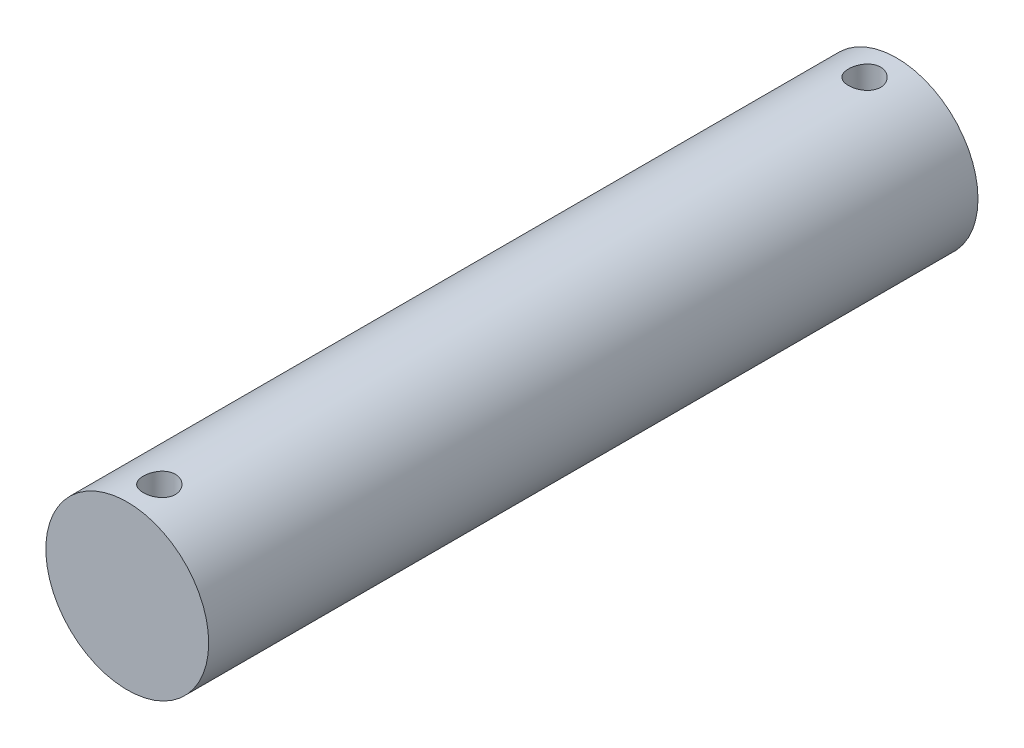
ISO-10303-21;
HEADER;
FILE_DESCRIPTION(('STEP AP214'),'2;1');
FILE_NAME('part.step','',(''),(''),'','','');
FILE_SCHEMA(('AUTOMOTIVE_DESIGN { 1 0 10303 214 1 1 1 1 }'));
ENDSEC;
DATA;
#1=APPLICATION_CONTEXT('core data for automotive mechanical design processes');
#2=APPLICATION_PROTOCOL_DEFINITION('international standard','automotive_design',2000,#1);
#3=PRODUCT_CONTEXT('',#1,'mechanical');
#4=PRODUCT('Part','Part','',(#3));
#5=PRODUCT_RELATED_PRODUCT_CATEGORY('part','',(#4));
#6=PRODUCT_DEFINITION_FORMATION('','',#4);
#7=PRODUCT_DEFINITION_CONTEXT('part definition',#1,'design');
#8=PRODUCT_DEFINITION('design','',#6,#7);
#9=PRODUCT_DEFINITION_SHAPE('','',#8);
#10=(LENGTH_UNIT() NAMED_UNIT(*) SI_UNIT(.MILLI.,.METRE.));
#11=(NAMED_UNIT(*) PLANE_ANGLE_UNIT() SI_UNIT($,.RADIAN.));
#12=(NAMED_UNIT(*) SI_UNIT($,.STERADIAN.) SOLID_ANGLE_UNIT());
#13=UNCERTAINTY_MEASURE_WITH_UNIT(LENGTH_MEASURE(1.E-05),#10,'distance_accuracy_value','');
#14=(GEOMETRIC_REPRESENTATION_CONTEXT(3) GLOBAL_UNCERTAINTY_ASSIGNED_CONTEXT((#13)) GLOBAL_UNIT_ASSIGNED_CONTEXT((#10,
#11,#12)) REPRESENTATION_CONTEXT('',''));
#15=CARTESIAN_POINT('',(0.,0.,0.));
#16=DIRECTION('',(0.,0.,1.));
#17=DIRECTION('',(1.,0.,0.));
#18=AXIS2_PLACEMENT_3D('',#15,#16,#17);
#19=CARTESIAN_POINT('',(0.,0.,30.));
#20=DIRECTION('',(0.,0.,-1.));
#21=DIRECTION('',(-1.,0.,0.));
#22=AXIS2_PLACEMENT_3D('',#19,#20,#21);
#23=CYLINDRICAL_SURFACE('',#22,6.35);
#24=CARTESIAN_POINT('',(0.,-6.35,28.75));
#25=CARTESIAN_POINT('',(0.0694939804326168,-6.34999872344055,28.7499974169715));
#26=CARTESIAN_POINT('',(0.139020856807098,-6.34884746695947,28.7441851223323));
#27=CARTESIAN_POINT('',(0.276110920333324,-6.34436590183971,28.7211070748804));
#28=CARTESIAN_POINT('',(0.343672476376258,-6.34103383426819,28.7038320766701));
#29=CARTESIAN_POINT('',(0.474829848521738,-6.33256289060586,28.6583817049578));
#30=CARTESIAN_POINT('',(0.53842934185297,-6.32742572017194,28.6302166190781));
#31=CARTESIAN_POINT('',(0.659995353609191,-6.31590367713382,28.5638157984467));
#32=CARTESIAN_POINT('',(0.717962238037103,-6.30951888568045,28.5255807186361));
#33=CARTESIAN_POINT('',(0.827384016512086,-6.29611102614492,28.439592456803));
#34=CARTESIAN_POINT('',(0.878754225040864,-6.28908132948856,28.3917325336094));
#35=CARTESIAN_POINT('',(0.97279132993701,-6.2752244237706,28.2880826520332));
#36=CARTESIAN_POINT('',(1.01545756098707,-6.26839723022205,28.2322920879986));
#37=CARTESIAN_POINT('',(1.09123391279336,-6.25565368156531,28.1137582073905));
#38=CARTESIAN_POINT('',(1.12425674252627,-6.24974585984846,28.0509580889053));
#39=CARTESIAN_POINT('',(1.17924978458522,-6.23960391049848,27.9205652920754));
#40=CARTESIAN_POINT('',(1.20122105276671,-6.23536962298579,27.8529730722677));
#41=CARTESIAN_POINT('',(1.23321317099972,-6.22912114018684,27.7158246277484));
#42=CARTESIAN_POINT('',(1.24338237441819,-6.22707940916392,27.6463042888271));
#43=CARTESIAN_POINT('',(1.25194241392171,-6.22536429547634,27.5065165241769));
#44=CARTESIAN_POINT('',(1.25033441599248,-6.22569067835976,27.4362491730926));
#45=CARTESIAN_POINT('',(1.23550573337242,-6.22864988383405,27.2980446635005));
#46=CARTESIAN_POINT('',(1.22245476039046,-6.23124899784788,27.2300884665944));
#47=CARTESIAN_POINT('',(1.18537832222863,-6.23840776786276,27.0973493828874));
#48=CARTESIAN_POINT('',(1.16135234775692,-6.24296751484584,27.0325666435043));
#49=CARTESIAN_POINT('',(1.10284485747249,-6.25356844492135,26.9075224046841));
#50=CARTESIAN_POINT('',(1.06829575022772,-6.25961915520019,26.8472933720178));
#51=CARTESIAN_POINT('',(0.989770436249241,-6.27251408593659,26.7334238611139));
#52=CARTESIAN_POINT('',(0.945793178637779,-6.27935839481092,26.6797841183792));
#53=CARTESIAN_POINT('',(0.848749620379544,-6.29321559250291,26.5796362168699));
#54=CARTESIAN_POINT('',(0.795538391483495,-6.30022934156696,26.5332684988953));
#55=CARTESIAN_POINT('',(0.682019835627286,-6.31352591556468,26.45009527077));
#56=CARTESIAN_POINT('',(0.621712423039484,-6.31980873167657,26.4132898760222));
#57=CARTESIAN_POINT('',(0.495559855492555,-6.33095024356266,26.3502614516207));
#58=CARTESIAN_POINT('',(0.429706667639598,-6.33580682618573,26.3240541029124));
#59=CARTESIAN_POINT('',(0.294415437445408,-6.34353255640573,26.2831134380031));
#60=CARTESIAN_POINT('',(0.224977816567589,-6.3464019370917,26.2683787760871));
#61=CARTESIAN_POINT('',(0.0856960204581712,-6.34979761511535,26.2509997147287));
#62=CARTESIAN_POINT('',(0.0158767138616836,-6.35036116751766,26.2481630611503));
#63=CARTESIAN_POINT('',(-0.123238319169052,-6.34918502460119,26.2541433055637));
#64=CARTESIAN_POINT('',(-0.192534073869591,-6.34744545453345,26.2629595698332));
#65=CARTESIAN_POINT('',(-0.328017411524045,-6.34188181040703,26.2918356330438));
#66=CARTESIAN_POINT('',(-0.394226758532904,-6.3380759676032,26.3117971377749));
#67=CARTESIAN_POINT('',(-0.522358707908791,-6.32880490671267,26.3622899053744));
#68=CARTESIAN_POINT('',(-0.584280996267096,-6.32333956723251,26.3928219415084));
#69=CARTESIAN_POINT('',(-0.702894389008585,-6.31126292459246,26.4640074630924));
#70=CARTESIAN_POINT('',(-0.759514422690819,-6.30463875071603,26.5047771413156));
#71=CARTESIAN_POINT('',(-0.865178401164784,-6.29101022941264,26.5951246432469));
#72=CARTESIAN_POINT('',(-0.914221559867103,-6.2840058426409,26.6447033797357));
#73=CARTESIAN_POINT('',(-1.00407868802173,-6.27028126377194,26.7521356229158));
#74=CARTESIAN_POINT('',(-1.04476087118854,-6.26356677403919,26.8101002099198));
#75=CARTESIAN_POINT('',(-1.11581163487925,-6.25130144140895,26.9321532154163));
#76=CARTESIAN_POINT('',(-1.14618062108292,-6.24575055274337,26.9962413929044));
#77=CARTESIAN_POINT('',(-1.19556121034271,-6.23648663322854,27.1284042020453));
#78=CARTESIAN_POINT('',(-1.21463070325767,-6.23276425161642,27.1964565174941));
#79=CARTESIAN_POINT('',(-1.24104736373123,-6.22755858712954,27.3348802434369));
#80=CARTESIAN_POINT('',(-1.24839600622804,-6.2260750225259,27.4052513609979));
#81=CARTESIAN_POINT('',(-1.25110911670658,-6.22553026233713,27.54499277197));
#82=CARTESIAN_POINT('',(-1.24668173183846,-6.22642699327119,27.6143589442989));
#83=CARTESIAN_POINT('',(-1.22642690288144,-6.23044796366243,27.7513372149343));
#84=CARTESIAN_POINT('',(-1.21059954408838,-6.23357218645326,27.8189493263609));
#85=CARTESIAN_POINT('',(-1.16808561930223,-6.24167758718142,27.9503730471303));
#86=CARTESIAN_POINT('',(-1.1414238104125,-6.24665452942732,28.0141929432507));
#87=CARTESIAN_POINT('',(-1.07802140699671,-6.25790715548942,28.1364863896161));
#88=CARTESIAN_POINT('',(-1.04128000120944,-6.26418294383389,28.1949595090179));
#89=CARTESIAN_POINT('',(-0.958047153780957,-6.27745535581054,28.305937625676));
#90=CARTESIAN_POINT('',(-0.911405090098397,-6.28446214955247,28.3583284614444));
#91=CARTESIAN_POINT('',(-0.810006714298533,-6.29833330286004,28.4546087685327));
#92=CARTESIAN_POINT('',(-0.755248540568529,-6.30519762933471,28.4984962840818));
#93=CARTESIAN_POINT('',(-0.638509398203909,-6.31809192156363,28.5769408554925));
#94=CARTESIAN_POINT('',(-0.576461177409875,-6.32411277788587,28.6113993840931));
#95=CARTESIAN_POINT('',(-0.447354677582577,-6.33455228311075,28.6693463510289));
#96=CARTESIAN_POINT('',(-0.38030102851324,-6.33897239107068,28.6928447849748));
#97=CARTESIAN_POINT('',(-0.260903753738919,-6.3448426925249,28.7235965876865));
#98=CARTESIAN_POINT('',(-0.209244697378744,-6.34676546742744,28.7334804045104));
#99=CARTESIAN_POINT('',(-0.10506334458243,-6.34934458466464,28.7466829882463));
#100=CARTESIAN_POINT('',(-0.0525410741960242,-6.35000096514553,28.7500019529043));
#101=CARTESIAN_POINT('',(0.,-6.35,28.75));
#102=B_SPLINE_CURVE_WITH_KNOTS('',3,(#24,#25,#26,#27,#28,#29,#30,#31,#32,#33,#34,#35,#36,#37,
#38,#39,#40,#41,#42,#43,#44,#45,#46,#47,#48,#49,#50,#51,#52,#53,#54,#55,#56,#57,#58,#59,#60,#61,
#62,#63,#64,#65,#66,#67,#68,#69,#70,#71,#72,#73,#74,#75,#76,#77,#78,#79,#80,#81,#82,#83,#84,#85,
#86,#87,#88,#89,#90,#91,#92,#93,#94,#95,#96,#97,#98,#99,#100,#101),.UNSPECIFIED.,.T.,.F.,(4,2,2,
2,2,2,2,2,2,2,2,2,2,2,2,2,2,2,2,2,2,2,2,2,2,2,2,2,2,2,2,2,2,2,2,2,2,2,4),(0.,0.20828974718966,
0.416747697814534,0.625009202121001,0.83325716468066,1.04395644558372,1.25467182595345,
1.46723931776154,1.67978649721884,1.88963196168972,2.09945665097822,2.3062210720878,
2.51299508901675,2.72112629808271,2.92928071788109,3.14105959839086,3.35284103463857,
3.56493468769528,3.77700345899184,3.98563198908576,4.19424917376995,4.40105490064573,
4.60787575916645,4.81715935266284,5.02646464445816,5.23885147330544,5.45122994673927,
5.66251073275075,5.87376492933512,6.08131002421398,6.28885356623402,6.4959255069745,
6.70301411889162,6.91351361259455,7.12406146403359,7.33673198768616,7.5492081746515,
7.70669083222362,7.86416874604055),.UNSPECIFIED.);
#103=CARTESIAN_POINT('',(0.,-6.35,28.75));
#104=VERTEX_POINT('',#103);
#105=EDGE_CURVE('E35',#104,#104,#102,.T.);
#106=ORIENTED_EDGE('',*,*,#105,.T.);
#107=EDGE_LOOP('',(#106));
#108=FACE_BOUND('',#107,.T.);
#109=CARTESIAN_POINT('',(0.,6.35,28.75));
#110=CARTESIAN_POINT('',(-0.0694939804326168,6.34999872344055,28.7499974169715));
#111=CARTESIAN_POINT('',(-0.139020856807098,6.34884746695947,28.7441851223323));
#112=CARTESIAN_POINT('',(-0.276110920333324,6.34436590183971,28.7211070748804));
#113=CARTESIAN_POINT('',(-0.343672476376258,6.34103383426819,28.7038320766701));
#114=CARTESIAN_POINT('',(-0.474829848521738,6.33256289060586,28.6583817049578));
#115=CARTESIAN_POINT('',(-0.53842934185297,6.32742572017194,28.6302166190781));
#116=CARTESIAN_POINT('',(-0.659995353609191,6.31590367713382,28.5638157984467));
#117=CARTESIAN_POINT('',(-0.717962238037103,6.30951888568045,28.5255807186361));
#118=CARTESIAN_POINT('',(-0.827384016512086,6.29611102614492,28.439592456803));
#119=CARTESIAN_POINT('',(-0.878754225040864,6.28908132948856,28.3917325336094));
#120=CARTESIAN_POINT('',(-0.97279132993701,6.2752244237706,28.2880826520332));
#121=CARTESIAN_POINT('',(-1.01545756098707,6.26839723022205,28.2322920879986));
#122=CARTESIAN_POINT('',(-1.09123391279336,6.25565368156531,28.1137582073905));
#123=CARTESIAN_POINT('',(-1.12425674252627,6.24974585984846,28.0509580889053));
#124=CARTESIAN_POINT('',(-1.17924978458522,6.23960391049848,27.9205652920754));
#125=CARTESIAN_POINT('',(-1.20122105276671,6.23536962298579,27.8529730722677));
#126=CARTESIAN_POINT('',(-1.23321317099972,6.22912114018684,27.7158246277484));
#127=CARTESIAN_POINT('',(-1.24338237441819,6.22707940916392,27.6463042888271));
#128=CARTESIAN_POINT('',(-1.25194241392171,6.22536429547634,27.5065165241769));
#129=CARTESIAN_POINT('',(-1.25033441599248,6.22569067835976,27.4362491730926));
#130=CARTESIAN_POINT('',(-1.23550573337242,6.22864988383405,27.2980446635005));
#131=CARTESIAN_POINT('',(-1.22245476039046,6.23124899784788,27.2300884665944));
#132=CARTESIAN_POINT('',(-1.18537832222863,6.23840776786276,27.0973493828874));
#133=CARTESIAN_POINT('',(-1.16135234775692,6.24296751484584,27.0325666435043));
#134=CARTESIAN_POINT('',(-1.10284485747249,6.25356844492135,26.9075224046841));
#135=CARTESIAN_POINT('',(-1.06829575022772,6.25961915520019,26.8472933720178));
#136=CARTESIAN_POINT('',(-0.989770436249241,6.27251408593659,26.7334238611139));
#137=CARTESIAN_POINT('',(-0.945793178637779,6.27935839481092,26.6797841183792));
#138=CARTESIAN_POINT('',(-0.848749620379544,6.29321559250291,26.5796362168699));
#139=CARTESIAN_POINT('',(-0.795538391483495,6.30022934156696,26.5332684988953));
#140=CARTESIAN_POINT('',(-0.682019835627286,6.31352591556468,26.45009527077));
#141=CARTESIAN_POINT('',(-0.621712423039484,6.31980873167657,26.4132898760222));
#142=CARTESIAN_POINT('',(-0.495559855492555,6.33095024356266,26.3502614516207));
#143=CARTESIAN_POINT('',(-0.429706667639598,6.33580682618573,26.3240541029124));
#144=CARTESIAN_POINT('',(-0.294415437445408,6.34353255640573,26.2831134380031));
#145=CARTESIAN_POINT('',(-0.224977816567589,6.3464019370917,26.2683787760871));
#146=CARTESIAN_POINT('',(-0.0856960204581712,6.34979761511535,26.2509997147287));
#147=CARTESIAN_POINT('',(-0.0158767138616836,6.35036116751766,26.2481630611503));
#148=CARTESIAN_POINT('',(0.123238319169052,6.34918502460119,26.2541433055637));
#149=CARTESIAN_POINT('',(0.192534073869591,6.34744545453345,26.2629595698332));
#150=CARTESIAN_POINT('',(0.328017411524045,6.34188181040703,26.2918356330438));
#151=CARTESIAN_POINT('',(0.394226758532904,6.3380759676032,26.3117971377749));
#152=CARTESIAN_POINT('',(0.522358707908791,6.32880490671267,26.3622899053744));
#153=CARTESIAN_POINT('',(0.584280996267096,6.32333956723251,26.3928219415084));
#154=CARTESIAN_POINT('',(0.702894389008585,6.31126292459246,26.4640074630924));
#155=CARTESIAN_POINT('',(0.759514422690819,6.30463875071603,26.5047771413156));
#156=CARTESIAN_POINT('',(0.865178401164784,6.29101022941264,26.5951246432469));
#157=CARTESIAN_POINT('',(0.914221559867103,6.2840058426409,26.6447033797357));
#158=CARTESIAN_POINT('',(1.00407868802173,6.27028126377194,26.7521356229158));
#159=CARTESIAN_POINT('',(1.04476087118854,6.26356677403919,26.8101002099198));
#160=CARTESIAN_POINT('',(1.11581163487925,6.25130144140895,26.9321532154163));
#161=CARTESIAN_POINT('',(1.14618062108292,6.24575055274337,26.9962413929044));
#162=CARTESIAN_POINT('',(1.19556121034271,6.23648663322854,27.1284042020453));
#163=CARTESIAN_POINT('',(1.21463070325767,6.23276425161642,27.1964565174941));
#164=CARTESIAN_POINT('',(1.24104736373123,6.22755858712954,27.3348802434369));
#165=CARTESIAN_POINT('',(1.24839600622804,6.2260750225259,27.4052513609979));
#166=CARTESIAN_POINT('',(1.25110911670658,6.22553026233713,27.54499277197));
#167=CARTESIAN_POINT('',(1.24668173183846,6.22642699327119,27.6143589442989));
#168=CARTESIAN_POINT('',(1.22642690288144,6.23044796366243,27.7513372149343));
#169=CARTESIAN_POINT('',(1.21059954408838,6.23357218645326,27.8189493263609));
#170=CARTESIAN_POINT('',(1.16808561930223,6.24167758718142,27.9503730471303));
#171=CARTESIAN_POINT('',(1.1414238104125,6.24665452942732,28.0141929432507));
#172=CARTESIAN_POINT('',(1.07802140699671,6.25790715548942,28.1364863896161));
#173=CARTESIAN_POINT('',(1.04128000120944,6.26418294383389,28.1949595090179));
#174=CARTESIAN_POINT('',(0.958047153780957,6.27745535581054,28.305937625676));
#175=CARTESIAN_POINT('',(0.911405090098397,6.28446214955247,28.3583284614444));
#176=CARTESIAN_POINT('',(0.810006714298533,6.29833330286004,28.4546087685327));
#177=CARTESIAN_POINT('',(0.755248540568529,6.30519762933471,28.4984962840818));
#178=CARTESIAN_POINT('',(0.638509398203909,6.31809192156363,28.5769408554925));
#179=CARTESIAN_POINT('',(0.576461177409875,6.32411277788587,28.6113993840931));
#180=CARTESIAN_POINT('',(0.447354677582577,6.33455228311075,28.6693463510289));
#181=CARTESIAN_POINT('',(0.38030102851324,6.33897239107068,28.6928447849748));
#182=CARTESIAN_POINT('',(0.260903753738919,6.3448426925249,28.7235965876865));
#183=CARTESIAN_POINT('',(0.209244697378744,6.34676546742744,28.7334804045104));
#184=CARTESIAN_POINT('',(0.10506334458243,6.34934458466464,28.7466829882463));
#185=CARTESIAN_POINT('',(0.0525410741960242,6.35000096514553,28.7500019529043));
#186=CARTESIAN_POINT('',(0.,6.35,28.75));
#187=B_SPLINE_CURVE_WITH_KNOTS('',3,(#109,#110,#111,#112,#113,#114,#115,#116,#117,#118,#119,
#120,#121,#122,#123,#124,#125,#126,#127,#128,#129,#130,#131,#132,#133,#134,#135,#136,#137,#138,
#139,#140,#141,#142,#143,#144,#145,#146,#147,#148,#149,#150,#151,#152,#153,#154,#155,#156,#157,
#158,#159,#160,#161,#162,#163,#164,#165,#166,#167,#168,#169,#170,#171,#172,#173,#174,#175,#176,
#177,#178,#179,#180,#181,#182,#183,#184,#185,#186),.UNSPECIFIED.,.T.,.F.,(4,2,2,2,2,2,2,2,2,2,2,
2,2,2,2,2,2,2,2,2,2,2,2,2,2,2,2,2,2,2,2,2,2,2,2,2,2,2,4),(0.,0.20828974718966,0.416747697814534,
0.625009202121001,0.83325716468066,1.04395644558372,1.25467182595345,1.46723931776154,
1.67978649721884,1.88963196168972,2.09945665097822,2.3062210720878,2.51299508901675,
2.72112629808271,2.92928071788109,3.14105959839086,3.35284103463857,3.56493468769528,
3.77700345899184,3.98563198908576,4.19424917376995,4.40105490064573,4.60787575916645,
4.81715935266284,5.02646464445816,5.23885147330544,5.45122994673927,5.66251073275075,
5.87376492933512,6.08131002421398,6.28885356623402,6.4959255069745,6.70301411889162,
6.91351361259455,7.12406146403359,7.33673198768616,7.5492081746515,7.70669083222362,
7.86416874604055),.UNSPECIFIED.);
#188=CARTESIAN_POINT('',(0.,6.35,28.75));
#189=VERTEX_POINT('',#188);
#190=EDGE_CURVE('E87',#189,#189,#187,.T.);
#191=ORIENTED_EDGE('',*,*,#190,.T.);
#192=EDGE_LOOP('',(#191));
#193=FACE_BOUND('',#192,.T.);
#194=CARTESIAN_POINT('',(0.,-6.35,-26.25));
#195=CARTESIAN_POINT('',(0.0694939804326171,-6.34999872344055,-26.2500025830285));
#196=CARTESIAN_POINT('',(0.139020856807098,-6.34884746695947,-26.2558148776677));
#197=CARTESIAN_POINT('',(0.276110920333324,-6.34436590183971,-26.2788929251196));
#198=CARTESIAN_POINT('',(0.343672476376258,-6.34103383426819,-26.2961679233299));
#199=CARTESIAN_POINT('',(0.474829848521738,-6.33256289060586,-26.3416182950422));
#200=CARTESIAN_POINT('',(0.53842934185297,-6.32742572017194,-26.3697833809219));
#201=CARTESIAN_POINT('',(0.659995353609191,-6.31590367713382,-26.4361842015533));
#202=CARTESIAN_POINT('',(0.717962238037103,-6.30951888568045,-26.4744192813639));
#203=CARTESIAN_POINT('',(0.827384016512086,-6.29611102614492,-26.560407543197));
#204=CARTESIAN_POINT('',(0.878754225040864,-6.28908132948856,-26.6082674663906));
#205=CARTESIAN_POINT('',(0.97279132993701,-6.2752244237706,-26.7119173479668));
#206=CARTESIAN_POINT('',(1.01545756098707,-6.26839723022205,-26.7677079120014));
#207=CARTESIAN_POINT('',(1.09123391279335,-6.25565368156531,-26.8862417926095));
#208=CARTESIAN_POINT('',(1.12425674252627,-6.24974585984846,-26.9490419110947));
#209=CARTESIAN_POINT('',(1.17924978458522,-6.23960391049848,-27.0794347079246));
#210=CARTESIAN_POINT('',(1.20122105276671,-6.23536962298579,-27.1470269277323));
#211=CARTESIAN_POINT('',(1.23321317099972,-6.22912114018685,-27.2841753722516));
#212=CARTESIAN_POINT('',(1.24338237441819,-6.22707940916393,-27.3536957111729));
#213=CARTESIAN_POINT('',(1.25194241392171,-6.22536429547634,-27.4934834758231));
#214=CARTESIAN_POINT('',(1.25033441599248,-6.22569067835976,-27.5637508269074));
#215=CARTESIAN_POINT('',(1.23550573337242,-6.22864988383405,-27.7019553364995));
#216=CARTESIAN_POINT('',(1.22245476039046,-6.23124899784788,-27.7699115334056));
#217=CARTESIAN_POINT('',(1.18537832222863,-6.23840776786276,-27.9026506171126));
#218=CARTESIAN_POINT('',(1.16135234775692,-6.24296751484584,-27.9674333564957));
#219=CARTESIAN_POINT('',(1.10284485747249,-6.25356844492134,-28.0924775953159));
#220=CARTESIAN_POINT('',(1.06829575022772,-6.25961915520019,-28.1527066279822));
#221=CARTESIAN_POINT('',(0.989770436249241,-6.27251408593659,-28.2665761388861));
#222=CARTESIAN_POINT('',(0.945793178637779,-6.27935839481092,-28.3202158816208));
#223=CARTESIAN_POINT('',(0.848749620379544,-6.29321559250291,-28.4203637831301));
#224=CARTESIAN_POINT('',(0.795538391483495,-6.30022934156696,-28.4667315011047));
#225=CARTESIAN_POINT('',(0.682019835627286,-6.31352591556468,-28.54990472923));
#226=CARTESIAN_POINT('',(0.621712423039484,-6.31980873167657,-28.5867101239778));
#227=CARTESIAN_POINT('',(0.495559855492555,-6.33095024356266,-28.6497385483793));
#228=CARTESIAN_POINT('',(0.429706667639598,-6.33580682618573,-28.6759458970876));
#229=CARTESIAN_POINT('',(0.294415437445408,-6.34353255640573,-28.7168865619969));
#230=CARTESIAN_POINT('',(0.224977816567589,-6.3464019370917,-28.7316212239129));
#231=CARTESIAN_POINT('',(0.0856960204581712,-6.34979761511535,-28.7490002852713));
#232=CARTESIAN_POINT('',(0.0158767138616836,-6.35036116751766,-28.7518369388497));
#233=CARTESIAN_POINT('',(-0.123238319169052,-6.34918502460119,-28.7458566944363));
#234=CARTESIAN_POINT('',(-0.192534073869591,-6.34744545453345,-28.7370404301668));
#235=CARTESIAN_POINT('',(-0.328017411524046,-6.34188181040703,-28.7081643669562));
#236=CARTESIAN_POINT('',(-0.394226758532905,-6.3380759676032,-28.6882028622251));
#237=CARTESIAN_POINT('',(-0.522358707908791,-6.32880490671267,-28.6377100946256));
#238=CARTESIAN_POINT('',(-0.584280996267096,-6.32333956723251,-28.6071780584916));
#239=CARTESIAN_POINT('',(-0.702894389008584,-6.31126292459246,-28.5359925369076));
#240=CARTESIAN_POINT('',(-0.759514422690817,-6.30463875071603,-28.4952228586844));
#241=CARTESIAN_POINT('',(-0.865178401164783,-6.29101022941264,-28.4048753567531));
#242=CARTESIAN_POINT('',(-0.914221559867102,-6.2840058426409,-28.3552966202643));
#243=CARTESIAN_POINT('',(-1.00407868802173,-6.27028126377194,-28.2478643770842));
#244=CARTESIAN_POINT('',(-1.04476087118854,-6.26356677403919,-28.1898997900802));
#245=CARTESIAN_POINT('',(-1.11581163487925,-6.25130144140895,-28.0678467845837));
#246=CARTESIAN_POINT('',(-1.14618062108292,-6.24575055274337,-28.0037586070956));
#247=CARTESIAN_POINT('',(-1.19556121034271,-6.23648663322854,-27.8715957979547));
#248=CARTESIAN_POINT('',(-1.21463070325767,-6.23276425161642,-27.8035434825059));
#249=CARTESIAN_POINT('',(-1.24104736373123,-6.22755858712954,-27.6651197565631));
#250=CARTESIAN_POINT('',(-1.24839600622804,-6.2260750225259,-27.5947486390021));
#251=CARTESIAN_POINT('',(-1.25110911670658,-6.22553026233713,-27.45500722803));
#252=CARTESIAN_POINT('',(-1.24668173183846,-6.22642699327119,-27.3856410557011));
#253=CARTESIAN_POINT('',(-1.22642690288144,-6.23044796366243,-27.2486627850657));
#254=CARTESIAN_POINT('',(-1.21059954408838,-6.23357218645326,-27.1810506736391));
#255=CARTESIAN_POINT('',(-1.16808561930223,-6.24167758718142,-27.0496269528697));
#256=CARTESIAN_POINT('',(-1.14142381041251,-6.24665452942732,-26.9858070567493));
#257=CARTESIAN_POINT('',(-1.07802140699671,-6.25790715548942,-26.8635136103839));
#258=CARTESIAN_POINT('',(-1.04128000120944,-6.26418294383389,-26.8050404909821));
#259=CARTESIAN_POINT('',(-0.958047153780958,-6.27745535581054,-26.694062374324));
#260=CARTESIAN_POINT('',(-0.911405090098398,-6.28446214955247,-26.6416715385556));
#261=CARTESIAN_POINT('',(-0.810006714298535,-6.29833330286004,-26.5453912314673));
#262=CARTESIAN_POINT('',(-0.75524854056853,-6.30519762933471,-26.5015037159183));
#263=CARTESIAN_POINT('',(-0.638509398203909,-6.31809192156363,-26.4230591445075));
#264=CARTESIAN_POINT('',(-0.576461177409875,-6.32411277788587,-26.3886006159069));
#265=CARTESIAN_POINT('',(-0.447354677582576,-6.33455228311075,-26.3306536489711));
#266=CARTESIAN_POINT('',(-0.38030102851324,-6.33897239107068,-26.3071552150252));
#267=CARTESIAN_POINT('',(-0.260903753738919,-6.3448426925249,-26.2764034123135));
#268=CARTESIAN_POINT('',(-0.209244697378744,-6.34676546742744,-26.2665195954896));
#269=CARTESIAN_POINT('',(-0.10506334458243,-6.34934458466464,-26.2533170117537));
#270=CARTESIAN_POINT('',(-0.0525410741960242,-6.35000096514553,-26.2499980470957));
#271=CARTESIAN_POINT('',(0.,-6.35,-26.25));
#272=B_SPLINE_CURVE_WITH_KNOTS('',3,(#194,#195,#196,#197,#198,#199,#200,#201,#202,#203,#204,
#205,#206,#207,#208,#209,#210,#211,#212,#213,#214,#215,#216,#217,#218,#219,#220,#221,#222,#223,
#224,#225,#226,#227,#228,#229,#230,#231,#232,#233,#234,#235,#236,#237,#238,#239,#240,#241,#242,
#243,#244,#245,#246,#247,#248,#249,#250,#251,#252,#253,#254,#255,#256,#257,#258,#259,#260,#261,
#262,#263,#264,#265,#266,#267,#268,#269,#270,#271),.UNSPECIFIED.,.T.,.F.,(4,2,2,2,2,2,2,2,2,2,2,
2,2,2,2,2,2,2,2,2,2,2,2,2,2,2,2,2,2,2,2,2,2,2,2,2,2,2,4),(0.,0.20828974718966,0.416747697814534,
0.625009202121001,0.83325716468066,1.04395644558372,1.25467182595345,1.46723931776153,
1.67978649721884,1.88963196168972,2.09945665097822,2.30622107208779,2.51299508901675,
2.72112629808271,2.92928071788109,3.14105959839087,3.35284103463857,3.56493468769528,
3.77700345899184,3.98563198908576,4.19424917376995,4.40105490064574,4.60787575916645,
4.81715935266284,5.02646464445816,5.23885147330544,5.45122994673928,5.66251073275075,
5.87376492933513,6.08131002421399,6.28885356623402,6.49592550697449,6.70301411889162,
6.91351361259455,7.12406146403359,7.33673198768616,7.5492081746515,7.70669083222363,
7.86416874604056),.UNSPECIFIED.);
#273=CARTESIAN_POINT('',(0.,-6.35,-26.25));
#274=VERTEX_POINT('',#273);
#275=EDGE_CURVE('E57',#274,#274,#272,.T.);
#276=ORIENTED_EDGE('',*,*,#275,.T.);
#277=EDGE_LOOP('',(#276));
#278=FACE_BOUND('',#277,.T.);
#279=CARTESIAN_POINT('',(0.,6.35,-26.25));
#280=CARTESIAN_POINT('',(-0.0694939804326171,6.34999872344055,-26.2500025830285));
#281=CARTESIAN_POINT('',(-0.139020856807098,6.34884746695947,-26.2558148776677));
#282=CARTESIAN_POINT('',(-0.276110920333324,6.34436590183971,-26.2788929251196));
#283=CARTESIAN_POINT('',(-0.343672476376258,6.34103383426819,-26.2961679233299));
#284=CARTESIAN_POINT('',(-0.474829848521738,6.33256289060586,-26.3416182950422));
#285=CARTESIAN_POINT('',(-0.53842934185297,6.32742572017194,-26.3697833809219));
#286=CARTESIAN_POINT('',(-0.659995353609191,6.31590367713382,-26.4361842015533));
#287=CARTESIAN_POINT('',(-0.717962238037103,6.30951888568045,-26.4744192813639));
#288=CARTESIAN_POINT('',(-0.827384016512086,6.29611102614492,-26.560407543197));
#289=CARTESIAN_POINT('',(-0.878754225040864,6.28908132948856,-26.6082674663906));
#290=CARTESIAN_POINT('',(-0.97279132993701,6.2752244237706,-26.7119173479668));
#291=CARTESIAN_POINT('',(-1.01545756098707,6.26839723022205,-26.7677079120014));
#292=CARTESIAN_POINT('',(-1.09123391279335,6.25565368156531,-26.8862417926095));
#293=CARTESIAN_POINT('',(-1.12425674252627,6.24974585984846,-26.9490419110947));
#294=CARTESIAN_POINT('',(-1.17924978458522,6.23960391049848,-27.0794347079246));
#295=CARTESIAN_POINT('',(-1.20122105276671,6.23536962298579,-27.1470269277323));
#296=CARTESIAN_POINT('',(-1.23321317099972,6.22912114018685,-27.2841753722516));
#297=CARTESIAN_POINT('',(-1.24338237441819,6.22707940916393,-27.3536957111729));
#298=CARTESIAN_POINT('',(-1.25194241392171,6.22536429547634,-27.4934834758231));
#299=CARTESIAN_POINT('',(-1.25033441599248,6.22569067835976,-27.5637508269074));
#300=CARTESIAN_POINT('',(-1.23550573337242,6.22864988383405,-27.7019553364995));
#301=CARTESIAN_POINT('',(-1.22245476039046,6.23124899784788,-27.7699115334056));
#302=CARTESIAN_POINT('',(-1.18537832222863,6.23840776786276,-27.9026506171126));
#303=CARTESIAN_POINT('',(-1.16135234775692,6.24296751484584,-27.9674333564957));
#304=CARTESIAN_POINT('',(-1.10284485747249,6.25356844492134,-28.0924775953159));
#305=CARTESIAN_POINT('',(-1.06829575022772,6.25961915520019,-28.1527066279822));
#306=CARTESIAN_POINT('',(-0.989770436249241,6.27251408593659,-28.2665761388861));
#307=CARTESIAN_POINT('',(-0.945793178637779,6.27935839481092,-28.3202158816208));
#308=CARTESIAN_POINT('',(-0.848749620379544,6.29321559250291,-28.4203637831301));
#309=CARTESIAN_POINT('',(-0.795538391483495,6.30022934156696,-28.4667315011047));
#310=CARTESIAN_POINT('',(-0.682019835627286,6.31352591556468,-28.54990472923));
#311=CARTESIAN_POINT('',(-0.621712423039484,6.31980873167657,-28.5867101239778));
#312=CARTESIAN_POINT('',(-0.495559855492555,6.33095024356266,-28.6497385483793));
#313=CARTESIAN_POINT('',(-0.429706667639598,6.33580682618573,-28.6759458970876));
#314=CARTESIAN_POINT('',(-0.294415437445408,6.34353255640573,-28.7168865619969));
#315=CARTESIAN_POINT('',(-0.224977816567589,6.3464019370917,-28.7316212239129));
#316=CARTESIAN_POINT('',(-0.0856960204581712,6.34979761511535,-28.7490002852713));
#317=CARTESIAN_POINT('',(-0.0158767138616836,6.35036116751766,-28.7518369388497));
#318=CARTESIAN_POINT('',(0.123238319169052,6.34918502460119,-28.7458566944363));
#319=CARTESIAN_POINT('',(0.192534073869591,6.34744545453345,-28.7370404301668));
#320=CARTESIAN_POINT('',(0.328017411524046,6.34188181040703,-28.7081643669562));
#321=CARTESIAN_POINT('',(0.394226758532905,6.3380759676032,-28.6882028622251));
#322=CARTESIAN_POINT('',(0.522358707908791,6.32880490671267,-28.6377100946256));
#323=CARTESIAN_POINT('',(0.584280996267096,6.32333956723251,-28.6071780584916));
#324=CARTESIAN_POINT('',(0.702894389008584,6.31126292459246,-28.5359925369076));
#325=CARTESIAN_POINT('',(0.759514422690817,6.30463875071603,-28.4952228586844));
#326=CARTESIAN_POINT('',(0.865178401164783,6.29101022941264,-28.4048753567531));
#327=CARTESIAN_POINT('',(0.914221559867102,6.2840058426409,-28.3552966202643));
#328=CARTESIAN_POINT('',(1.00407868802173,6.27028126377194,-28.2478643770842));
#329=CARTESIAN_POINT('',(1.04476087118854,6.26356677403919,-28.1898997900802));
#330=CARTESIAN_POINT('',(1.11581163487925,6.25130144140895,-28.0678467845837));
#331=CARTESIAN_POINT('',(1.14618062108292,6.24575055274337,-28.0037586070956));
#332=CARTESIAN_POINT('',(1.19556121034271,6.23648663322854,-27.8715957979547));
#333=CARTESIAN_POINT('',(1.21463070325767,6.23276425161642,-27.8035434825059));
#334=CARTESIAN_POINT('',(1.24104736373123,6.22755858712954,-27.6651197565631));
#335=CARTESIAN_POINT('',(1.24839600622804,6.2260750225259,-27.5947486390021));
#336=CARTESIAN_POINT('',(1.25110911670658,6.22553026233713,-27.45500722803));
#337=CARTESIAN_POINT('',(1.24668173183846,6.22642699327119,-27.3856410557011));
#338=CARTESIAN_POINT('',(1.22642690288144,6.23044796366243,-27.2486627850657));
#339=CARTESIAN_POINT('',(1.21059954408838,6.23357218645326,-27.1810506736391));
#340=CARTESIAN_POINT('',(1.16808561930223,6.24167758718142,-27.0496269528697));
#341=CARTESIAN_POINT('',(1.14142381041251,6.24665452942732,-26.9858070567493));
#342=CARTESIAN_POINT('',(1.07802140699671,6.25790715548942,-26.8635136103839));
#343=CARTESIAN_POINT('',(1.04128000120944,6.26418294383389,-26.8050404909821));
#344=CARTESIAN_POINT('',(0.958047153780958,6.27745535581054,-26.694062374324));
#345=CARTESIAN_POINT('',(0.911405090098398,6.28446214955247,-26.6416715385556));
#346=CARTESIAN_POINT('',(0.810006714298535,6.29833330286004,-26.5453912314673));
#347=CARTESIAN_POINT('',(0.75524854056853,6.30519762933471,-26.5015037159183));
#348=CARTESIAN_POINT('',(0.638509398203909,6.31809192156363,-26.4230591445075));
#349=CARTESIAN_POINT('',(0.576461177409875,6.32411277788587,-26.3886006159069));
#350=CARTESIAN_POINT('',(0.447354677582576,6.33455228311075,-26.3306536489711));
#351=CARTESIAN_POINT('',(0.38030102851324,6.33897239107068,-26.3071552150252));
#352=CARTESIAN_POINT('',(0.260903753738919,6.3448426925249,-26.2764034123135));
#353=CARTESIAN_POINT('',(0.209244697378744,6.34676546742744,-26.2665195954896));
#354=CARTESIAN_POINT('',(0.10506334458243,6.34934458466464,-26.2533170117537));
#355=CARTESIAN_POINT('',(0.0525410741960242,6.35000096514553,-26.2499980470957));
#356=CARTESIAN_POINT('',(0.,6.35,-26.25));
#357=B_SPLINE_CURVE_WITH_KNOTS('',3,(#279,#280,#281,#282,#283,#284,#285,#286,#287,#288,#289,
#290,#291,#292,#293,#294,#295,#296,#297,#298,#299,#300,#301,#302,#303,#304,#305,#306,#307,#308,
#309,#310,#311,#312,#313,#314,#315,#316,#317,#318,#319,#320,#321,#322,#323,#324,#325,#326,#327,
#328,#329,#330,#331,#332,#333,#334,#335,#336,#337,#338,#339,#340,#341,#342,#343,#344,#345,#346,
#347,#348,#349,#350,#351,#352,#353,#354,#355,#356),.UNSPECIFIED.,.T.,.F.,(4,2,2,2,2,2,2,2,2,2,2,
2,2,2,2,2,2,2,2,2,2,2,2,2,2,2,2,2,2,2,2,2,2,2,2,2,2,2,4),(0.,0.20828974718966,0.416747697814534,
0.625009202121001,0.83325716468066,1.04395644558372,1.25467182595345,1.46723931776153,
1.67978649721884,1.88963196168972,2.09945665097822,2.30622107208779,2.51299508901675,
2.72112629808271,2.92928071788109,3.14105959839087,3.35284103463857,3.56493468769528,
3.77700345899184,3.98563198908576,4.19424917376995,4.40105490064574,4.60787575916645,
4.81715935266284,5.02646464445816,5.23885147330544,5.45122994673928,5.66251073275075,
5.87376492933513,6.08131002421399,6.28885356623402,6.49592550697449,6.70301411889162,
6.91351361259455,7.12406146403359,7.33673198768616,7.5492081746515,7.70669083222363,
7.86416874604056),.UNSPECIFIED.);
#358=CARTESIAN_POINT('',(0.,6.35,-26.25));
#359=VERTEX_POINT('',#358);
#360=EDGE_CURVE('E50',#359,#359,#357,.T.);
#361=ORIENTED_EDGE('',*,*,#360,.T.);
#362=EDGE_LOOP('',(#361));
#363=FACE_BOUND('',#362,.T.);
#364=CARTESIAN_POINT('',(0.,0.,30.));
#365=DIRECTION('',(0.,0.,1.));
#366=DIRECTION('',(1.,0.,0.));
#367=AXIS2_PLACEMENT_3D('',#364,#365,#366);
#368=CIRCLE('',#367,6.35);
#369=CARTESIAN_POINT('',(6.35,0.,30.));
#370=VERTEX_POINT('',#369);
#371=EDGE_CURVE('E10',#370,#370,#368,.T.);
#372=ORIENTED_EDGE('',*,*,#371,.F.);
#373=EDGE_LOOP('',(#372));
#374=FACE_BOUND('',#373,.T.);
#375=CARTESIAN_POINT('',(0.,0.,-30.));
#376=DIRECTION('',(0.,0.,1.));
#377=DIRECTION('',(1.,0.,0.));
#378=AXIS2_PLACEMENT_3D('',#375,#376,#377);
#379=CIRCLE('',#378,6.35);
#380=CARTESIAN_POINT('',(6.35,0.,-30.));
#381=VERTEX_POINT('',#380);
#382=EDGE_CURVE('E43',#381,#381,#379,.T.);
#383=ORIENTED_EDGE('',*,*,#382,.T.);
#384=EDGE_LOOP('',(#383));
#385=FACE_BOUND('',#384,.T.);
#386=ADVANCED_FACE('F31',(#108,#193,#278,#363,#374,#385),#23,.T.);
#387=CARTESIAN_POINT('',(0.,0.,30.));
#388=DIRECTION('',(0.,0.,1.));
#389=DIRECTION('',(1.,0.,0.));
#390=AXIS2_PLACEMENT_3D('',#387,#388,#389);
#391=PLANE('',#390);
#392=ORIENTED_EDGE('',*,*,#371,.T.);
#393=EDGE_LOOP('',(#392));
#394=FACE_BOUND('',#393,.T.);
#395=ADVANCED_FACE('F69',(#394),#391,.T.);
#396=CARTESIAN_POINT('',(0.,0.,-30.));
#397=DIRECTION('',(0.,0.,1.));
#398=DIRECTION('',(1.,0.,0.));
#399=AXIS2_PLACEMENT_3D('',#396,#397,#398);
#400=PLANE('',#399);
#401=ORIENTED_EDGE('',*,*,#382,.F.);
#402=EDGE_LOOP('',(#401));
#403=FACE_BOUND('',#402,.T.);
#404=ADVANCED_FACE('F66',(#403),#400,.F.);
#405=CARTESIAN_POINT('',(0.,-25.,-27.5));
#406=DIRECTION('',(0.,1.,0.));
#407=DIRECTION('',(0.,0.,1.));
#408=AXIS2_PLACEMENT_3D('',#405,#406,#407);
#409=CYLINDRICAL_SURFACE('',#408,1.25);
#410=ORIENTED_EDGE('',*,*,#360,.F.);
#411=EDGE_LOOP('',(#410));
#412=FACE_BOUND('',#411,.T.);
#413=ORIENTED_EDGE('',*,*,#275,.F.);
#414=EDGE_LOOP('',(#413));
#415=FACE_BOUND('',#414,.T.);
#416=ADVANCED_FACE('F61',(#412,#415),#409,.F.);
#417=CARTESIAN_POINT('',(0.,-25.,27.5));
#418=DIRECTION('',(0.,1.,0.));
#419=DIRECTION('',(0.,0.,1.));
#420=AXIS2_PLACEMENT_3D('',#417,#418,#419);
#421=CYLINDRICAL_SURFACE('',#420,1.25);
#422=ORIENTED_EDGE('',*,*,#190,.F.);
#423=EDGE_LOOP('',(#422));
#424=FACE_BOUND('',#423,.T.);
#425=ORIENTED_EDGE('',*,*,#105,.F.);
#426=EDGE_LOOP('',(#425));
#427=FACE_BOUND('',#426,.T.);
#428=ADVANCED_FACE('F65',(#424,#427),#421,.F.);
#429=CLOSED_SHELL('',(#386,#395,#404,#416,#428));
#430=MANIFOLD_SOLID_BREP('B2',#429);
#431=ADVANCED_BREP_SHAPE_REPRESENTATION('',(#18,#430),#14);
#432=SHAPE_DEFINITION_REPRESENTATION(#9,#431);
ENDSEC;
END-ISO-10303-21;
